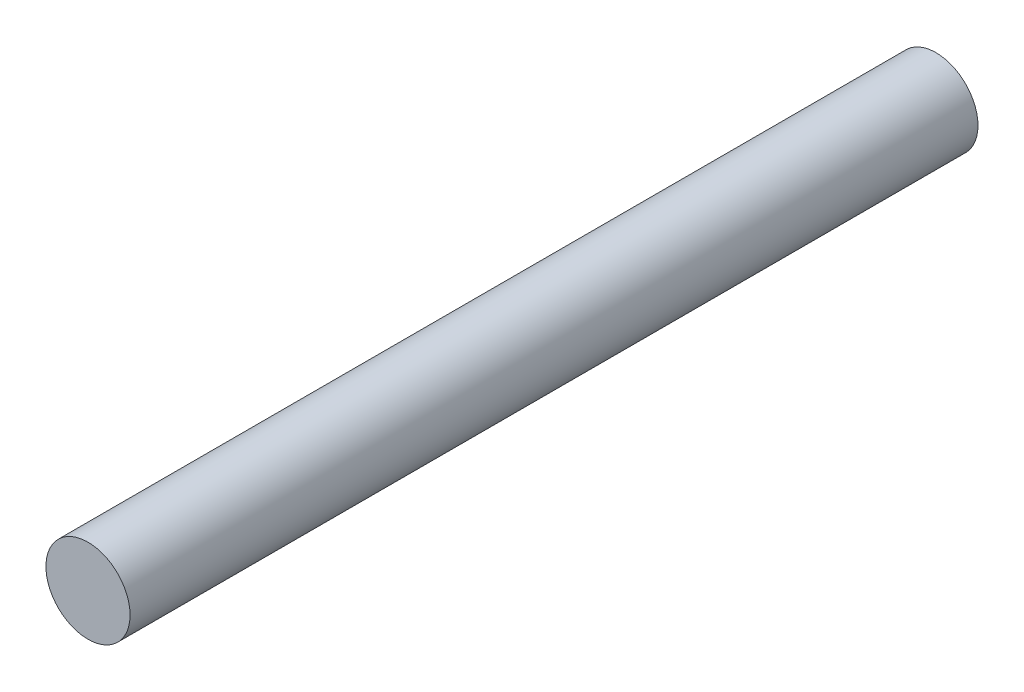
ISO-10303-21;
HEADER;
FILE_DESCRIPTION(('STEP AP214'),'2;1');
FILE_NAME('part.step','',(''),(''),'','','');
FILE_SCHEMA(('AUTOMOTIVE_DESIGN { 1 0 10303 214 1 1 1 1 }'));
ENDSEC;
DATA;
#1=APPLICATION_CONTEXT('core data for automotive mechanical design processes');
#2=APPLICATION_PROTOCOL_DEFINITION('international standard','automotive_design',2000,#1);
#3=PRODUCT_CONTEXT('',#1,'mechanical');
#4=PRODUCT('Part','Part','',(#3));
#5=PRODUCT_RELATED_PRODUCT_CATEGORY('part','',(#4));
#6=PRODUCT_DEFINITION_FORMATION('','',#4);
#7=PRODUCT_DEFINITION_CONTEXT('part definition',#1,'design');
#8=PRODUCT_DEFINITION('design','',#6,#7);
#9=PRODUCT_DEFINITION_SHAPE('','',#8);
#10=(LENGTH_UNIT() NAMED_UNIT(*) SI_UNIT(.MILLI.,.METRE.));
#11=(NAMED_UNIT(*) PLANE_ANGLE_UNIT() SI_UNIT($,.RADIAN.));
#12=(NAMED_UNIT(*) SI_UNIT($,.STERADIAN.) SOLID_ANGLE_UNIT());
#13=UNCERTAINTY_MEASURE_WITH_UNIT(LENGTH_MEASURE(1.E-05),#10,'distance_accuracy_value','');
#14=(GEOMETRIC_REPRESENTATION_CONTEXT(3) GLOBAL_UNCERTAINTY_ASSIGNED_CONTEXT((#13)) GLOBAL_UNIT_ASSIGNED_CONTEXT((#10,
#11,#12)) REPRESENTATION_CONTEXT('',''));
#15=CARTESIAN_POINT('',(0.,0.,0.));
#16=DIRECTION('',(0.,0.,1.));
#17=DIRECTION('',(1.,0.,0.));
#18=AXIS2_PLACEMENT_3D('',#15,#16,#17);
#19=CARTESIAN_POINT('',(20.,20.,80.));
#20=DIRECTION('',(0.,0.,-1.));
#21=DIRECTION('',(-1.,0.,0.));
#22=AXIS2_PLACEMENT_3D('',#19,#20,#21);
#23=CYLINDRICAL_SURFACE('',#22,3.96875);
#24=CARTESIAN_POINT('',(20.,20.,80.));
#25=DIRECTION('',(0.,0.,1.));
#26=DIRECTION('',(1.,0.,0.));
#27=AXIS2_PLACEMENT_3D('',#24,#25,#26);
#28=CIRCLE('',#27,3.96875);
#29=CARTESIAN_POINT('',(23.96875,20.,80.));
#30=VERTEX_POINT('',#29);
#31=EDGE_CURVE('E10',#30,#30,#28,.T.);
#32=ORIENTED_EDGE('',*,*,#31,.F.);
#33=EDGE_LOOP('',(#32));
#34=FACE_BOUND('',#33,.T.);
#35=CARTESIAN_POINT('',(20.,20.,0.));
#36=DIRECTION('',(0.,0.,1.));
#37=DIRECTION('',(1.,0.,0.));
#38=AXIS2_PLACEMENT_3D('',#35,#36,#37);
#39=CIRCLE('',#38,3.96875);
#40=CARTESIAN_POINT('',(23.96875,20.,0.));
#41=VERTEX_POINT('',#40);
#42=EDGE_CURVE('E38',#41,#41,#39,.T.);
#43=ORIENTED_EDGE('',*,*,#42,.T.);
#44=EDGE_LOOP('',(#43));
#45=FACE_BOUND('',#44,.T.);
#46=ADVANCED_FACE('F35',(#34,#45),#23,.T.);
#47=CARTESIAN_POINT('',(20.,20.,80.));
#48=DIRECTION('',(0.,0.,1.));
#49=DIRECTION('',(1.,0.,0.));
#50=AXIS2_PLACEMENT_3D('',#47,#48,#49);
#51=PLANE('',#50);
#52=ORIENTED_EDGE('',*,*,#31,.T.);
#53=EDGE_LOOP('',(#52));
#54=FACE_BOUND('',#53,.T.);
#55=ADVANCED_FACE('F50',(#54),#51,.T.);
#56=CARTESIAN_POINT('',(20.,20.,0.));
#57=DIRECTION('',(0.,0.,1.));
#58=DIRECTION('',(1.,0.,0.));
#59=AXIS2_PLACEMENT_3D('',#56,#57,#58);
#60=PLANE('',#59);
#61=ORIENTED_EDGE('',*,*,#42,.F.);
#62=EDGE_LOOP('',(#61));
#63=FACE_BOUND('',#62,.T.);
#64=ADVANCED_FACE('F48',(#63),#60,.F.);
#65=CLOSED_SHELL('',(#46,#55,#64));
#66=MANIFOLD_SOLID_BREP('B2',#65);
#67=ADVANCED_BREP_SHAPE_REPRESENTATION('',(#18,#66),#14);
#68=SHAPE_DEFINITION_REPRESENTATION(#9,#67);
ENDSEC;
END-ISO-10303-21;
